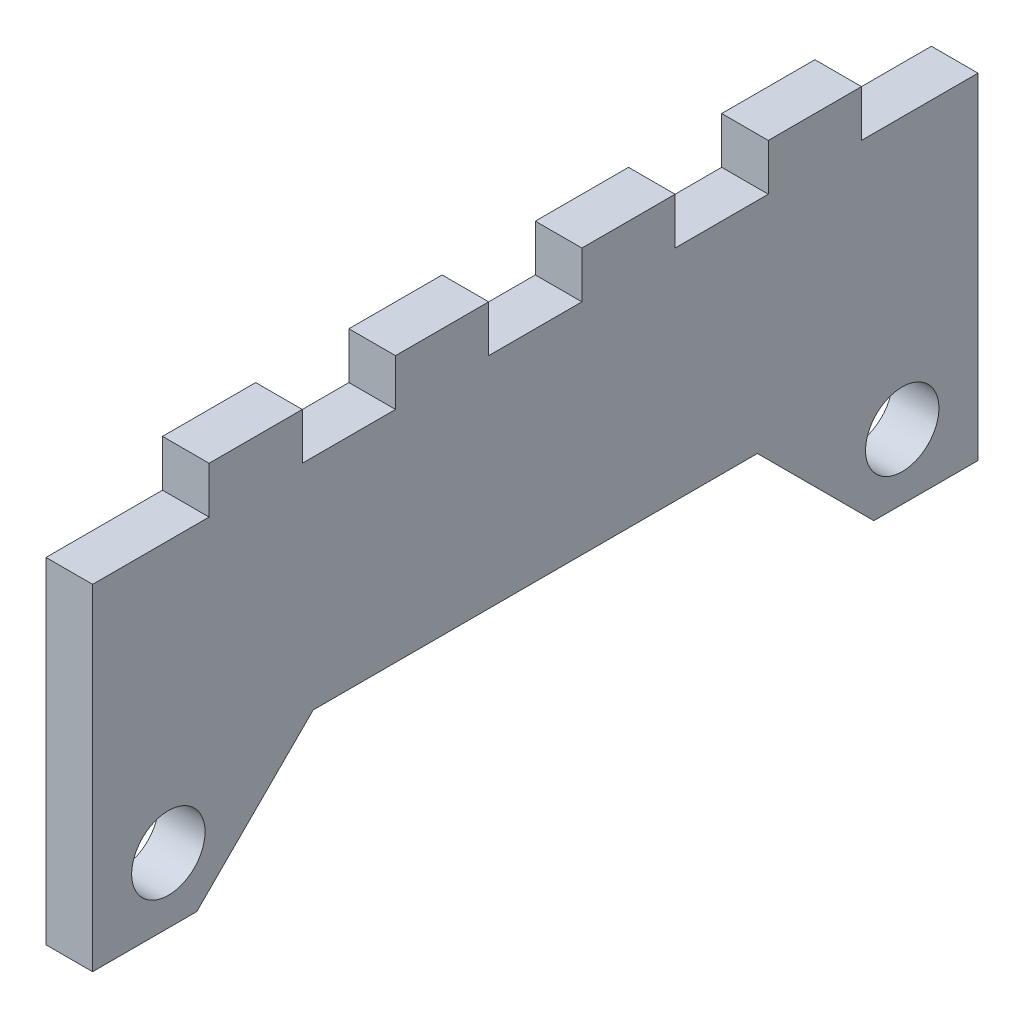
ISO-10303-21;
HEADER;
FILE_DESCRIPTION(('STEP AP214'),'2;1');
FILE_NAME('part.step','',(''),(''),'','','');
FILE_SCHEMA(('AUTOMOTIVE_DESIGN { 1 0 10303 214 1 1 1 1 }'));
ENDSEC;
DATA;
#1=APPLICATION_CONTEXT('core data for automotive mechanical design processes');
#2=APPLICATION_PROTOCOL_DEFINITION('international standard','automotive_design',2000,#1);
#3=PRODUCT_CONTEXT('',#1,'mechanical');
#4=PRODUCT('Part','Part','',(#3));
#5=PRODUCT_RELATED_PRODUCT_CATEGORY('part','',(#4));
#6=PRODUCT_DEFINITION_FORMATION('','',#4);
#7=PRODUCT_DEFINITION_CONTEXT('part definition',#1,'design');
#8=PRODUCT_DEFINITION('design','',#6,#7);
#9=PRODUCT_DEFINITION_SHAPE('','',#8);
#10=(LENGTH_UNIT() NAMED_UNIT(*) SI_UNIT(.MILLI.,.METRE.));
#11=(NAMED_UNIT(*) PLANE_ANGLE_UNIT() SI_UNIT($,.RADIAN.));
#12=(NAMED_UNIT(*) SI_UNIT($,.STERADIAN.) SOLID_ANGLE_UNIT());
#13=UNCERTAINTY_MEASURE_WITH_UNIT(LENGTH_MEASURE(1.E-05),#10,'distance_accuracy_value','');
#14=(GEOMETRIC_REPRESENTATION_CONTEXT(3) GLOBAL_UNCERTAINTY_ASSIGNED_CONTEXT((#13)) GLOBAL_UNIT_ASSIGNED_CONTEXT((#10,
#11,#12)) REPRESENTATION_CONTEXT('',''));
#15=CARTESIAN_POINT('',(0.,0.,0.));
#16=DIRECTION('',(0.,0.,1.));
#17=DIRECTION('',(1.,0.,0.));
#18=AXIS2_PLACEMENT_3D('',#15,#16,#17);
#19=CARTESIAN_POINT('',(3.175,22.86,0.));
#20=DIRECTION('',(-1.,0.,0.));
#21=DIRECTION('',(0.,0.,1.));
#22=AXIS2_PLACEMENT_3D('',#19,#20,#21);
#23=PLANE('',#22);
#24=CARTESIAN_POINT('',(3.175,4.43,-5.1625));
#25=DIRECTION('',(1.,0.,0.));
#26=DIRECTION('',(0.,0.,-1.));
#27=AXIS2_PLACEMENT_3D('',#24,#25,#26);
#28=CIRCLE('',#27,2.5);
#29=CARTESIAN_POINT('',(3.175,4.43,-7.6625));
#30=VERTEX_POINT('',#29);
#31=EDGE_CURVE('E230',#30,#30,#28,.T.);
#32=ORIENTED_EDGE('',*,*,#31,.F.);
#33=EDGE_LOOP('',(#32));
#34=FACE_BOUND('',#33,.T.);
#35=DIRECTION('',(0.,-1.,0.));
#36=VECTOR('',#35,1.);
#37=CARTESIAN_POINT('',(3.175,0.,0.));
#38=LINE('',#37,#36);
#39=CARTESIAN_POINT('',(3.175,22.86,0.));
#40=VERTEX_POINT('',#39);
#41=CARTESIAN_POINT('',(3.175,0.,0.));
#42=VERTEX_POINT('',#41);
#43=EDGE_CURVE('E273',#40,#42,#38,.T.);
#44=ORIENTED_EDGE('',*,*,#43,.T.);
#45=DIRECTION('',(0.,0.,-1.));
#46=VECTOR('',#45,1.);
#47=CARTESIAN_POINT('',(3.175,0.,0.));
#48=LINE('',#47,#46);
#49=CARTESIAN_POINT('',(3.175,0.,-7.09646103067893));
#50=VERTEX_POINT('',#49);
#51=EDGE_CURVE('E141',#42,#50,#48,.T.);
#52=ORIENTED_EDGE('',*,*,#51,.T.);
#53=DIRECTION('',(0.,0.707106781186549,-0.707106781186546));
#54=VECTOR('',#53,1.);
#55=CARTESIAN_POINT('',(3.175,0.,-7.09646103067893));
#56=LINE('',#55,#54);
#57=CARTESIAN_POINT('',(3.175,7.93000000000001,-15.0264610306789));
#58=VERTEX_POINT('',#57);
#59=EDGE_CURVE('E336',#50,#58,#56,.T.);
#60=ORIENTED_EDGE('',*,*,#59,.T.);
#61=DIRECTION('',(0.,0.,-1.));
#62=VECTOR('',#61,1.);
#63=CARTESIAN_POINT('',(3.175,7.93000000000001,-15.0264610306789));
#64=LINE('',#63,#62);
#65=CARTESIAN_POINT('',(3.175,7.93000000000006,-45.2985389693211));
#66=VERTEX_POINT('',#65);
#67=EDGE_CURVE('E355',#58,#66,#64,.T.);
#68=ORIENTED_EDGE('',*,*,#67,.T.);
#69=DIRECTION('',(0.,-0.707106781186546,-0.707106781186549));
#70=VECTOR('',#69,1.);
#71=CARTESIAN_POINT('',(3.175,0.,-53.2285389693211));
#72=LINE('',#71,#70);
#73=CARTESIAN_POINT('',(3.175,0.,-53.2285389693211));
#74=VERTEX_POINT('',#73);
#75=EDGE_CURVE('E352',#66,#74,#72,.T.);
#76=ORIENTED_EDGE('',*,*,#75,.T.);
#77=DIRECTION('',(0.,0.,-1.));
#78=VECTOR('',#77,1.);
#79=CARTESIAN_POINT('',(3.175,0.,-53.2285389693211));
#80=LINE('',#79,#78);
#81=CARTESIAN_POINT('',(3.175,0.,-60.325));
#82=VERTEX_POINT('',#81);
#83=EDGE_CURVE('E354',#74,#82,#80,.T.);
#84=ORIENTED_EDGE('',*,*,#83,.T.);
#85=DIRECTION('',(0.,1.,0.));
#86=VECTOR('',#85,1.);
#87=CARTESIAN_POINT('',(3.175,0.,-60.325));
#88=LINE('',#87,#86);
#89=CARTESIAN_POINT('',(3.175,22.86,-60.325));
#90=VERTEX_POINT('',#89);
#91=EDGE_CURVE('E357',#82,#90,#88,.T.);
#92=ORIENTED_EDGE('',*,*,#91,.T.);
#93=DIRECTION('',(0.,0.,1.));
#94=VECTOR('',#93,1.);
#95=CARTESIAN_POINT('',(3.175,22.86,-52.3875));
#96=LINE('',#95,#94);
#97=CARTESIAN_POINT('',(3.175,22.86,-52.3875));
#98=VERTEX_POINT('',#97);
#99=EDGE_CURVE('E363',#90,#98,#96,.T.);
#100=ORIENTED_EDGE('',*,*,#99,.T.);
#101=DIRECTION('',(0.,1.,0.));
#102=VECTOR('',#101,1.);
#103=CARTESIAN_POINT('',(3.175,22.86,-52.3875));
#104=LINE('',#103,#102);
#105=CARTESIAN_POINT('',(3.175,26.035,-52.3875));
#106=VERTEX_POINT('',#105);
#107=EDGE_CURVE('E365',#98,#106,#104,.T.);
#108=ORIENTED_EDGE('',*,*,#107,.T.);
#109=DIRECTION('',(0.,0.,1.));
#110=VECTOR('',#109,1.);
#111=CARTESIAN_POINT('',(3.175,26.035,-52.3875));
#112=LINE('',#111,#110);
#113=CARTESIAN_POINT('',(3.175,26.035,-46.0375));
#114=VERTEX_POINT('',#113);
#115=EDGE_CURVE('E367',#106,#114,#112,.T.);
#116=ORIENTED_EDGE('',*,*,#115,.T.);
#117=DIRECTION('',(0.,-1.,0.));
#118=VECTOR('',#117,1.);
#119=CARTESIAN_POINT('',(3.175,26.035,-46.0375));
#120=LINE('',#119,#118);
#121=CARTESIAN_POINT('',(3.175,22.86,-46.0375));
#122=VERTEX_POINT('',#121);
#123=EDGE_CURVE('E369',#114,#122,#120,.T.);
#124=ORIENTED_EDGE('',*,*,#123,.T.);
#125=DIRECTION('',(0.,0.,1.));
#126=VECTOR('',#125,1.);
#127=CARTESIAN_POINT('',(3.175,22.86,-39.6875));
#128=LINE('',#127,#126);
#129=CARTESIAN_POINT('',(3.175,22.86,-39.6875));
#130=VERTEX_POINT('',#129);
#131=EDGE_CURVE('E371',#122,#130,#128,.T.);
#132=ORIENTED_EDGE('',*,*,#131,.T.);
#133=DIRECTION('',(0.,1.,0.));
#134=VECTOR('',#133,1.);
#135=CARTESIAN_POINT('',(3.175,22.86,-39.6875));
#136=LINE('',#135,#134);
#137=CARTESIAN_POINT('',(3.175,26.035,-39.6875));
#138=VERTEX_POINT('',#137);
#139=EDGE_CURVE('E373',#130,#138,#136,.T.);
#140=ORIENTED_EDGE('',*,*,#139,.T.);
#141=DIRECTION('',(0.,0.,1.));
#142=VECTOR('',#141,1.);
#143=CARTESIAN_POINT('',(3.175,26.035,-39.6875));
#144=LINE('',#143,#142);
#145=CARTESIAN_POINT('',(3.175,26.035,-33.3375));
#146=VERTEX_POINT('',#145);
#147=EDGE_CURVE('E375',#138,#146,#144,.T.);
#148=ORIENTED_EDGE('',*,*,#147,.T.);
#149=DIRECTION('',(0.,-1.,0.));
#150=VECTOR('',#149,1.);
#151=CARTESIAN_POINT('',(3.175,26.035,-33.3375));
#152=LINE('',#151,#150);
#153=CARTESIAN_POINT('',(3.175,22.86,-33.3375));
#154=VERTEX_POINT('',#153);
#155=EDGE_CURVE('E377',#146,#154,#152,.T.);
#156=ORIENTED_EDGE('',*,*,#155,.T.);
#157=DIRECTION('',(0.,0.,1.));
#158=VECTOR('',#157,1.);
#159=CARTESIAN_POINT('',(3.175,22.86,-26.9875));
#160=LINE('',#159,#158);
#161=CARTESIAN_POINT('',(3.175,22.86,-26.9875));
#162=VERTEX_POINT('',#161);
#163=EDGE_CURVE('E379',#154,#162,#160,.T.);
#164=ORIENTED_EDGE('',*,*,#163,.T.);
#165=DIRECTION('',(0.,1.,0.));
#166=VECTOR('',#165,1.);
#167=CARTESIAN_POINT('',(3.175,22.86,-26.9875));
#168=LINE('',#167,#166);
#169=CARTESIAN_POINT('',(3.175,26.035,-26.9875));
#170=VERTEX_POINT('',#169);
#171=EDGE_CURVE('E381',#162,#170,#168,.T.);
#172=ORIENTED_EDGE('',*,*,#171,.T.);
#173=DIRECTION('',(0.,0.,1.));
#174=VECTOR('',#173,1.);
#175=CARTESIAN_POINT('',(3.175,26.035,-26.9875));
#176=LINE('',#175,#174);
#177=CARTESIAN_POINT('',(3.175,26.035,-20.6375));
#178=VERTEX_POINT('',#177);
#179=EDGE_CURVE('E383',#170,#178,#176,.T.);
#180=ORIENTED_EDGE('',*,*,#179,.T.);
#181=DIRECTION('',(0.,-1.,0.));
#182=VECTOR('',#181,1.);
#183=CARTESIAN_POINT('',(3.175,26.035,-20.6375));
#184=LINE('',#183,#182);
#185=CARTESIAN_POINT('',(3.175,22.86,-20.6375));
#186=VERTEX_POINT('',#185);
#187=EDGE_CURVE('E385',#178,#186,#184,.T.);
#188=ORIENTED_EDGE('',*,*,#187,.T.);
#189=DIRECTION('',(0.,0.,1.));
#190=VECTOR('',#189,1.);
#191=CARTESIAN_POINT('',(3.175,22.86,-14.2875));
#192=LINE('',#191,#190);
#193=CARTESIAN_POINT('',(3.175,22.86,-14.2875));
#194=VERTEX_POINT('',#193);
#195=EDGE_CURVE('E387',#186,#194,#192,.T.);
#196=ORIENTED_EDGE('',*,*,#195,.T.);
#197=DIRECTION('',(0.,1.,0.));
#198=VECTOR('',#197,1.);
#199=CARTESIAN_POINT('',(3.175,22.86,-14.2875));
#200=LINE('',#199,#198);
#201=CARTESIAN_POINT('',(3.175,26.0349999999999,-14.2875));
#202=VERTEX_POINT('',#201);
#203=EDGE_CURVE('E208',#194,#202,#200,.T.);
#204=ORIENTED_EDGE('',*,*,#203,.T.);
#205=DIRECTION('',(0.,0.,1.));
#206=VECTOR('',#205,1.);
#207=CARTESIAN_POINT('',(3.175,26.0349999999999,-14.2875));
#208=LINE('',#207,#206);
#209=CARTESIAN_POINT('',(3.175,26.035,-7.9375));
#210=VERTEX_POINT('',#209);
#211=EDGE_CURVE('E202',#202,#210,#208,.T.);
#212=ORIENTED_EDGE('',*,*,#211,.T.);
#213=DIRECTION('',(0.,-1.,0.));
#214=VECTOR('',#213,1.);
#215=CARTESIAN_POINT('',(3.175,26.035,-7.9375));
#216=LINE('',#215,#214);
#217=CARTESIAN_POINT('',(3.175,22.86,-7.9375));
#218=VERTEX_POINT('',#217);
#219=EDGE_CURVE('E206',#210,#218,#216,.T.);
#220=ORIENTED_EDGE('',*,*,#219,.T.);
#221=DIRECTION('',(0.,0.,1.));
#222=VECTOR('',#221,1.);
#223=CARTESIAN_POINT('',(3.175,22.86,0.));
#224=LINE('',#223,#222);
#225=EDGE_CURVE('E50',#218,#40,#224,.T.);
#226=ORIENTED_EDGE('',*,*,#225,.T.);
#227=EDGE_LOOP('',(#44,#52,#60,#68,#76,#84,#92,#100,#108,#116,#124,#132,#140,#148,#156,#164,
#172,#180,#188,#196,#204,#212,#220,#226));
#228=FACE_BOUND('',#227,.T.);
#229=CARTESIAN_POINT('',(3.175,4.43000000000001,-55.1625));
#230=DIRECTION('',(1.,0.,0.));
#231=DIRECTION('',(0.,0.,1.));
#232=AXIS2_PLACEMENT_3D('',#229,#230,#231);
#233=CIRCLE('',#232,2.5);
#234=CARTESIAN_POINT('',(3.175,4.43000000000001,-52.6625));
#235=VERTEX_POINT('',#234);
#236=EDGE_CURVE('E430',#235,#235,#233,.T.);
#237=ORIENTED_EDGE('',*,*,#236,.F.);
#238=EDGE_LOOP('',(#237));
#239=FACE_BOUND('',#238,.T.);
#240=ADVANCED_FACE('F33',(#34,#228,#239),#23,.F.);
#241=CARTESIAN_POINT('',(0.,22.86,0.));
#242=DIRECTION('',(-1.,0.,0.));
#243=DIRECTION('',(0.,0.,1.));
#244=AXIS2_PLACEMENT_3D('',#241,#242,#243);
#245=PLANE('',#244);
#246=CARTESIAN_POINT('',(0.,4.43,-5.1625));
#247=DIRECTION('',(1.,0.,0.));
#248=DIRECTION('',(0.,0.,-1.));
#249=AXIS2_PLACEMENT_3D('',#246,#247,#248);
#250=CIRCLE('',#249,2.5);
#251=CARTESIAN_POINT('',(0.,4.43,-7.6625));
#252=VERTEX_POINT('',#251);
#253=EDGE_CURVE('E435',#252,#252,#250,.T.);
#254=ORIENTED_EDGE('',*,*,#253,.T.);
#255=EDGE_LOOP('',(#254));
#256=FACE_BOUND('',#255,.T.);
#257=DIRECTION('',(0.,-1.,0.));
#258=VECTOR('',#257,1.);
#259=CARTESIAN_POINT('',(0.,0.,0.));
#260=LINE('',#259,#258);
#261=CARTESIAN_POINT('',(0.,22.86,0.));
#262=VERTEX_POINT('',#261);
#263=CARTESIAN_POINT('',(0.,0.,0.));
#264=VERTEX_POINT('',#263);
#265=EDGE_CURVE('E226',#262,#264,#260,.T.);
#266=ORIENTED_EDGE('',*,*,#265,.F.);
#267=DIRECTION('',(0.,0.,1.));
#268=VECTOR('',#267,1.);
#269=CARTESIAN_POINT('',(0.,22.86,0.));
#270=LINE('',#269,#268);
#271=CARTESIAN_POINT('',(0.,22.86,-7.9375));
#272=VERTEX_POINT('',#271);
#273=EDGE_CURVE('E133',#272,#262,#270,.T.);
#274=ORIENTED_EDGE('',*,*,#273,.F.);
#275=DIRECTION('',(0.,-1.,0.));
#276=VECTOR('',#275,1.);
#277=CARTESIAN_POINT('',(0.,26.035,-7.9375));
#278=LINE('',#277,#276);
#279=CARTESIAN_POINT('',(0.,26.035,-7.9375));
#280=VERTEX_POINT('',#279);
#281=EDGE_CURVE('E127',#280,#272,#278,.T.);
#282=ORIENTED_EDGE('',*,*,#281,.F.);
#283=DIRECTION('',(0.,0.,1.));
#284=VECTOR('',#283,1.);
#285=CARTESIAN_POINT('',(0.,26.0349999999999,-14.2875));
#286=LINE('',#285,#284);
#287=CARTESIAN_POINT('',(0.,26.0349999999999,-14.2875));
#288=VERTEX_POINT('',#287);
#289=EDGE_CURVE('E216',#288,#280,#286,.T.);
#290=ORIENTED_EDGE('',*,*,#289,.F.);
#291=DIRECTION('',(0.,1.,0.));
#292=VECTOR('',#291,1.);
#293=CARTESIAN_POINT('',(0.,22.86,-14.2875));
#294=LINE('',#293,#292);
#295=CARTESIAN_POINT('',(0.,22.86,-14.2875));
#296=VERTEX_POINT('',#295);
#297=EDGE_CURVE('E268',#296,#288,#294,.T.);
#298=ORIENTED_EDGE('',*,*,#297,.F.);
#299=DIRECTION('',(0.,0.,1.));
#300=VECTOR('',#299,1.);
#301=CARTESIAN_POINT('',(0.,22.86,-14.2875));
#302=LINE('',#301,#300);
#303=CARTESIAN_POINT('',(0.,22.86,-20.6375));
#304=VERTEX_POINT('',#303);
#305=EDGE_CURVE('E266',#304,#296,#302,.T.);
#306=ORIENTED_EDGE('',*,*,#305,.F.);
#307=DIRECTION('',(0.,-1.,0.));
#308=VECTOR('',#307,1.);
#309=CARTESIAN_POINT('',(0.,26.035,-20.6375));
#310=LINE('',#309,#308);
#311=CARTESIAN_POINT('',(0.,26.035,-20.6375));
#312=VERTEX_POINT('',#311);
#313=EDGE_CURVE('E264',#312,#304,#310,.T.);
#314=ORIENTED_EDGE('',*,*,#313,.F.);
#315=DIRECTION('',(0.,0.,1.));
#316=VECTOR('',#315,1.);
#317=CARTESIAN_POINT('',(0.,26.035,-26.9875));
#318=LINE('',#317,#316);
#319=CARTESIAN_POINT('',(0.,26.035,-26.9875));
#320=VERTEX_POINT('',#319);
#321=EDGE_CURVE('E262',#320,#312,#318,.T.);
#322=ORIENTED_EDGE('',*,*,#321,.F.);
#323=DIRECTION('',(0.,1.,0.));
#324=VECTOR('',#323,1.);
#325=CARTESIAN_POINT('',(0.,22.86,-26.9875));
#326=LINE('',#325,#324);
#327=CARTESIAN_POINT('',(0.,22.86,-26.9875));
#328=VERTEX_POINT('',#327);
#329=EDGE_CURVE('E260',#328,#320,#326,.T.);
#330=ORIENTED_EDGE('',*,*,#329,.F.);
#331=DIRECTION('',(0.,0.,1.));
#332=VECTOR('',#331,1.);
#333=CARTESIAN_POINT('',(0.,22.86,-26.9875));
#334=LINE('',#333,#332);
#335=CARTESIAN_POINT('',(0.,22.86,-33.3375));
#336=VERTEX_POINT('',#335);
#337=EDGE_CURVE('E258',#336,#328,#334,.T.);
#338=ORIENTED_EDGE('',*,*,#337,.F.);
#339=DIRECTION('',(0.,-1.,0.));
#340=VECTOR('',#339,1.);
#341=CARTESIAN_POINT('',(0.,26.035,-33.3375));
#342=LINE('',#341,#340);
#343=CARTESIAN_POINT('',(0.,26.035,-33.3375));
#344=VERTEX_POINT('',#343);
#345=EDGE_CURVE('E256',#344,#336,#342,.T.);
#346=ORIENTED_EDGE('',*,*,#345,.F.);
#347=DIRECTION('',(0.,0.,1.));
#348=VECTOR('',#347,1.);
#349=CARTESIAN_POINT('',(0.,26.035,-39.6875));
#350=LINE('',#349,#348);
#351=CARTESIAN_POINT('',(0.,26.035,-39.6875));
#352=VERTEX_POINT('',#351);
#353=EDGE_CURVE('E254',#352,#344,#350,.T.);
#354=ORIENTED_EDGE('',*,*,#353,.F.);
#355=DIRECTION('',(0.,1.,0.));
#356=VECTOR('',#355,1.);
#357=CARTESIAN_POINT('',(0.,22.86,-39.6875));
#358=LINE('',#357,#356);
#359=CARTESIAN_POINT('',(0.,22.86,-39.6875));
#360=VERTEX_POINT('',#359);
#361=EDGE_CURVE('E252',#360,#352,#358,.T.);
#362=ORIENTED_EDGE('',*,*,#361,.F.);
#363=DIRECTION('',(0.,0.,1.));
#364=VECTOR('',#363,1.);
#365=CARTESIAN_POINT('',(0.,22.86,-39.6875));
#366=LINE('',#365,#364);
#367=CARTESIAN_POINT('',(0.,22.86,-46.0375));
#368=VERTEX_POINT('',#367);
#369=EDGE_CURVE('E250',#368,#360,#366,.T.);
#370=ORIENTED_EDGE('',*,*,#369,.F.);
#371=DIRECTION('',(0.,-1.,0.));
#372=VECTOR('',#371,1.);
#373=CARTESIAN_POINT('',(0.,26.035,-46.0375));
#374=LINE('',#373,#372);
#375=CARTESIAN_POINT('',(0.,26.035,-46.0375));
#376=VERTEX_POINT('',#375);
#377=EDGE_CURVE('E248',#376,#368,#374,.T.);
#378=ORIENTED_EDGE('',*,*,#377,.F.);
#379=DIRECTION('',(0.,0.,1.));
#380=VECTOR('',#379,1.);
#381=CARTESIAN_POINT('',(0.,26.035,-52.3875));
#382=LINE('',#381,#380);
#383=CARTESIAN_POINT('',(0.,26.035,-52.3875));
#384=VERTEX_POINT('',#383);
#385=EDGE_CURVE('E246',#384,#376,#382,.T.);
#386=ORIENTED_EDGE('',*,*,#385,.F.);
#387=DIRECTION('',(0.,1.,0.));
#388=VECTOR('',#387,1.);
#389=CARTESIAN_POINT('',(0.,22.86,-52.3875));
#390=LINE('',#389,#388);
#391=CARTESIAN_POINT('',(0.,22.86,-52.3875));
#392=VERTEX_POINT('',#391);
#393=EDGE_CURVE('E244',#392,#384,#390,.T.);
#394=ORIENTED_EDGE('',*,*,#393,.F.);
#395=DIRECTION('',(0.,0.,1.));
#396=VECTOR('',#395,1.);
#397=CARTESIAN_POINT('',(0.,22.86,-52.3875));
#398=LINE('',#397,#396);
#399=CARTESIAN_POINT('',(0.,22.86,-60.325));
#400=VERTEX_POINT('',#399);
#401=EDGE_CURVE('E242',#400,#392,#398,.T.);
#402=ORIENTED_EDGE('',*,*,#401,.F.);
#403=DIRECTION('',(0.,1.,0.));
#404=VECTOR('',#403,1.);
#405=CARTESIAN_POINT('',(0.,0.,-60.325));
#406=LINE('',#405,#404);
#407=CARTESIAN_POINT('',(0.,0.,-60.325));
#408=VERTEX_POINT('',#407);
#409=EDGE_CURVE('E240',#408,#400,#406,.T.);
#410=ORIENTED_EDGE('',*,*,#409,.F.);
#411=DIRECTION('',(0.,0.,-1.));
#412=VECTOR('',#411,1.);
#413=CARTESIAN_POINT('',(0.,0.,-53.2285389693211));
#414=LINE('',#413,#412);
#415=CARTESIAN_POINT('',(0.,0.,-53.2285389693211));
#416=VERTEX_POINT('',#415);
#417=EDGE_CURVE('E238',#416,#408,#414,.T.);
#418=ORIENTED_EDGE('',*,*,#417,.F.);
#419=DIRECTION('',(0.,-0.707106781186546,-0.707106781186549));
#420=VECTOR('',#419,1.);
#421=CARTESIAN_POINT('',(0.,0.,-53.2285389693211));
#422=LINE('',#421,#420);
#423=CARTESIAN_POINT('',(0.,7.93000000000006,-45.2985389693211));
#424=VERTEX_POINT('',#423);
#425=EDGE_CURVE('E236',#424,#416,#422,.T.);
#426=ORIENTED_EDGE('',*,*,#425,.F.);
#427=DIRECTION('',(0.,0.,-1.));
#428=VECTOR('',#427,1.);
#429=CARTESIAN_POINT('',(0.,7.93000000000001,-15.0264610306789));
#430=LINE('',#429,#428);
#431=CARTESIAN_POINT('',(0.,7.93000000000001,-15.0264610306789));
#432=VERTEX_POINT('',#431);
#433=EDGE_CURVE('E234',#432,#424,#430,.T.);
#434=ORIENTED_EDGE('',*,*,#433,.F.);
#435=DIRECTION('',(0.,0.707106781186549,-0.707106781186546));
#436=VECTOR('',#435,1.);
#437=CARTESIAN_POINT('',(0.,0.,-7.09646103067893));
#438=LINE('',#437,#436);
#439=CARTESIAN_POINT('',(0.,0.,-7.09646103067893));
#440=VERTEX_POINT('',#439);
#441=EDGE_CURVE('E232',#440,#432,#438,.T.);
#442=ORIENTED_EDGE('',*,*,#441,.F.);
#443=DIRECTION('',(0.,0.,-1.));
#444=VECTOR('',#443,1.);
#445=CARTESIAN_POINT('',(0.,0.,0.));
#446=LINE('',#445,#444);
#447=EDGE_CURVE('E229',#264,#440,#446,.T.);
#448=ORIENTED_EDGE('',*,*,#447,.F.);
#449=EDGE_LOOP('',(#266,#274,#282,#290,#298,#306,#314,#322,#330,#338,#346,#354,#362,#370,#378,
#386,#394,#402,#410,#418,#426,#434,#442,#448));
#450=FACE_BOUND('',#449,.T.);
#451=CARTESIAN_POINT('',(0.,4.43000000000001,-55.1625));
#452=DIRECTION('',(1.,0.,0.));
#453=DIRECTION('',(0.,0.,1.));
#454=AXIS2_PLACEMENT_3D('',#451,#452,#453);
#455=CIRCLE('',#454,2.5);
#456=CARTESIAN_POINT('',(0.,4.43000000000001,-52.6625));
#457=VERTEX_POINT('',#456);
#458=EDGE_CURVE('E433',#457,#457,#455,.T.);
#459=ORIENTED_EDGE('',*,*,#458,.T.);
#460=EDGE_LOOP('',(#459));
#461=FACE_BOUND('',#460,.T.);
#462=ADVANCED_FACE('F340',(#256,#450,#461),#245,.T.);
#463=CARTESIAN_POINT('',(3.175,0.,0.));
#464=DIRECTION('',(0.,0.,-1.));
#465=DIRECTION('',(-1.,0.,0.));
#466=AXIS2_PLACEMENT_3D('',#463,#464,#465);
#467=PLANE('',#466);
#468=ORIENTED_EDGE('',*,*,#265,.T.);
#469=DIRECTION('',(-1.,0.,0.));
#470=VECTOR('',#469,1.);
#471=CARTESIAN_POINT('',(3.175,0.,0.));
#472=LINE('',#471,#470);
#473=EDGE_CURVE('E11',#42,#264,#472,.T.);
#474=ORIENTED_EDGE('',*,*,#473,.F.);
#475=ORIENTED_EDGE('',*,*,#43,.F.);
#476=DIRECTION('',(-1.,0.,0.));
#477=VECTOR('',#476,1.);
#478=CARTESIAN_POINT('',(3.175,22.86,0.));
#479=LINE('',#478,#477);
#480=EDGE_CURVE('E222',#40,#262,#479,.T.);
#481=ORIENTED_EDGE('',*,*,#480,.T.);
#482=EDGE_LOOP('',(#468,#474,#475,#481));
#483=FACE_BOUND('',#482,.T.);
#484=ADVANCED_FACE('F35',(#483),#467,.F.);
#485=CARTESIAN_POINT('',(3.175,0.,0.));
#486=DIRECTION('',(0.,1.,0.));
#487=DIRECTION('',(0.,0.,1.));
#488=AXIS2_PLACEMENT_3D('',#485,#486,#487);
#489=PLANE('',#488);
#490=ORIENTED_EDGE('',*,*,#447,.T.);
#491=DIRECTION('',(-1.,0.,0.));
#492=VECTOR('',#491,1.);
#493=CARTESIAN_POINT('',(3.175,0.,-7.09646103067893));
#494=LINE('',#493,#492);
#495=EDGE_CURVE('E42',#50,#440,#494,.T.);
#496=ORIENTED_EDGE('',*,*,#495,.F.);
#497=ORIENTED_EDGE('',*,*,#51,.F.);
#498=ORIENTED_EDGE('',*,*,#473,.T.);
#499=EDGE_LOOP('',(#490,#496,#497,#498));
#500=FACE_BOUND('',#499,.T.);
#501=ADVANCED_FACE('F648',(#500),#489,.F.);
#502=CARTESIAN_POINT('',(3.175,0.,-7.09646103067893));
#503=DIRECTION('',(0.,0.707106781186546,0.707106781186549));
#504=DIRECTION('',(0.,-0.707106781186549,0.707106781186546));
#505=AXIS2_PLACEMENT_3D('',#502,#503,#504);
#506=PLANE('',#505);
#507=ORIENTED_EDGE('',*,*,#441,.T.);
#508=DIRECTION('',(-1.,0.,0.));
#509=VECTOR('',#508,1.);
#510=CARTESIAN_POINT('',(3.175,7.93000000000001,-15.0264610306789));
#511=LINE('',#510,#509);
#512=EDGE_CURVE('E328',#58,#432,#511,.T.);
#513=ORIENTED_EDGE('',*,*,#512,.F.);
#514=ORIENTED_EDGE('',*,*,#59,.F.);
#515=ORIENTED_EDGE('',*,*,#495,.T.);
#516=EDGE_LOOP('',(#507,#513,#514,#515));
#517=FACE_BOUND('',#516,.T.);
#518=ADVANCED_FACE('F334',(#517),#506,.F.);
#519=CARTESIAN_POINT('',(3.175,7.93000000000001,-15.0264610306789));
#520=DIRECTION('',(0.,1.,0.));
#521=DIRECTION('',(0.,0.,1.));
#522=AXIS2_PLACEMENT_3D('',#519,#520,#521);
#523=PLANE('',#522);
#524=ORIENTED_EDGE('',*,*,#433,.T.);
#525=DIRECTION('',(-1.,0.,0.));
#526=VECTOR('',#525,1.);
#527=CARTESIAN_POINT('',(3.175,7.93000000000006,-45.2985389693211));
#528=LINE('',#527,#526);
#529=EDGE_CURVE('E325',#66,#424,#528,.T.);
#530=ORIENTED_EDGE('',*,*,#529,.F.);
#531=ORIENTED_EDGE('',*,*,#67,.F.);
#532=ORIENTED_EDGE('',*,*,#512,.T.);
#533=EDGE_LOOP('',(#524,#530,#531,#532));
#534=FACE_BOUND('',#533,.T.);
#535=ADVANCED_FACE('F346',(#534),#523,.F.);
#536=CARTESIAN_POINT('',(3.175,0.,-53.2285389693211));
#537=DIRECTION('',(0.,0.707106781186549,-0.707106781186546));
#538=DIRECTION('',(0.,0.707106781186546,0.707106781186549));
#539=AXIS2_PLACEMENT_3D('',#536,#537,#538);
#540=PLANE('',#539);
#541=ORIENTED_EDGE('',*,*,#425,.T.);
#542=DIRECTION('',(-1.,0.,0.));
#543=VECTOR('',#542,1.);
#544=CARTESIAN_POINT('',(3.175,0.,-53.2285389693211));
#545=LINE('',#544,#543);
#546=EDGE_CURVE('E322',#74,#416,#545,.T.);
#547=ORIENTED_EDGE('',*,*,#546,.F.);
#548=ORIENTED_EDGE('',*,*,#75,.F.);
#549=ORIENTED_EDGE('',*,*,#529,.T.);
#550=EDGE_LOOP('',(#541,#547,#548,#549));
#551=FACE_BOUND('',#550,.T.);
#552=ADVANCED_FACE('F350',(#551),#540,.F.);
#553=CARTESIAN_POINT('',(3.175,0.,-53.2285389693211));
#554=DIRECTION('',(0.,1.,0.));
#555=DIRECTION('',(0.,0.,1.));
#556=AXIS2_PLACEMENT_3D('',#553,#554,#555);
#557=PLANE('',#556);
#558=ORIENTED_EDGE('',*,*,#417,.T.);
#559=DIRECTION('',(-1.,0.,0.));
#560=VECTOR('',#559,1.);
#561=CARTESIAN_POINT('',(3.175,0.,-60.325));
#562=LINE('',#561,#560);
#563=EDGE_CURVE('E319',#82,#408,#562,.T.);
#564=ORIENTED_EDGE('',*,*,#563,.F.);
#565=ORIENTED_EDGE('',*,*,#83,.F.);
#566=ORIENTED_EDGE('',*,*,#546,.T.);
#567=EDGE_LOOP('',(#558,#564,#565,#566));
#568=FACE_BOUND('',#567,.T.);
#569=ADVANCED_FACE('F613',(#568),#557,.F.);
#570=CARTESIAN_POINT('',(3.175,0.,-60.325));
#571=DIRECTION('',(0.,0.,1.));
#572=DIRECTION('',(1.,0.,0.));
#573=AXIS2_PLACEMENT_3D('',#570,#571,#572);
#574=PLANE('',#573);
#575=ORIENTED_EDGE('',*,*,#409,.T.);
#576=DIRECTION('',(-1.,0.,0.));
#577=VECTOR('',#576,1.);
#578=CARTESIAN_POINT('',(3.175,22.86,-60.325));
#579=LINE('',#578,#577);
#580=EDGE_CURVE('E316',#90,#400,#579,.T.);
#581=ORIENTED_EDGE('',*,*,#580,.F.);
#582=ORIENTED_EDGE('',*,*,#91,.F.);
#583=ORIENTED_EDGE('',*,*,#563,.T.);
#584=EDGE_LOOP('',(#575,#581,#582,#583));
#585=FACE_BOUND('',#584,.T.);
#586=ADVANCED_FACE('F603',(#585),#574,.F.);
#587=CARTESIAN_POINT('',(3.175,22.86,-52.3875));
#588=DIRECTION('',(0.,-1.,0.));
#589=DIRECTION('',(0.,0.,-1.));
#590=AXIS2_PLACEMENT_3D('',#587,#588,#589);
#591=PLANE('',#590);
#592=ORIENTED_EDGE('',*,*,#401,.T.);
#593=DIRECTION('',(-1.,0.,0.));
#594=VECTOR('',#593,1.);
#595=CARTESIAN_POINT('',(3.175,22.86,-52.3875));
#596=LINE('',#595,#594);
#597=EDGE_CURVE('E313',#98,#392,#596,.T.);
#598=ORIENTED_EDGE('',*,*,#597,.F.);
#599=ORIENTED_EDGE('',*,*,#99,.F.);
#600=ORIENTED_EDGE('',*,*,#580,.T.);
#601=EDGE_LOOP('',(#592,#598,#599,#600));
#602=FACE_BOUND('',#601,.T.);
#603=ADVANCED_FACE('F593',(#602),#591,.F.);
#604=CARTESIAN_POINT('',(3.175,22.86,-52.3875));
#605=DIRECTION('',(0.,0.,1.));
#606=DIRECTION('',(1.,0.,0.));
#607=AXIS2_PLACEMENT_3D('',#604,#605,#606);
#608=PLANE('',#607);
#609=ORIENTED_EDGE('',*,*,#393,.T.);
#610=DIRECTION('',(-1.,0.,0.));
#611=VECTOR('',#610,1.);
#612=CARTESIAN_POINT('',(3.175,26.035,-52.3875));
#613=LINE('',#612,#611);
#614=EDGE_CURVE('E310',#106,#384,#613,.T.);
#615=ORIENTED_EDGE('',*,*,#614,.F.);
#616=ORIENTED_EDGE('',*,*,#107,.F.);
#617=ORIENTED_EDGE('',*,*,#597,.T.);
#618=EDGE_LOOP('',(#609,#615,#616,#617));
#619=FACE_BOUND('',#618,.T.);
#620=ADVANCED_FACE('F583',(#619),#608,.F.);
#621=CARTESIAN_POINT('',(3.175,26.035,-52.3875));
#622=DIRECTION('',(0.,-1.,0.));
#623=DIRECTION('',(0.,0.,-1.));
#624=AXIS2_PLACEMENT_3D('',#621,#622,#623);
#625=PLANE('',#624);
#626=ORIENTED_EDGE('',*,*,#385,.T.);
#627=DIRECTION('',(-1.,0.,0.));
#628=VECTOR('',#627,1.);
#629=CARTESIAN_POINT('',(3.175,26.035,-46.0375));
#630=LINE('',#629,#628);
#631=EDGE_CURVE('E307',#114,#376,#630,.T.);
#632=ORIENTED_EDGE('',*,*,#631,.F.);
#633=ORIENTED_EDGE('',*,*,#115,.F.);
#634=ORIENTED_EDGE('',*,*,#614,.T.);
#635=EDGE_LOOP('',(#626,#632,#633,#634));
#636=FACE_BOUND('',#635,.T.);
#637=ADVANCED_FACE('F573',(#636),#625,.F.);
#638=CARTESIAN_POINT('',(3.175,26.035,-46.0375));
#639=DIRECTION('',(0.,0.,-1.));
#640=DIRECTION('',(-1.,0.,0.));
#641=AXIS2_PLACEMENT_3D('',#638,#639,#640);
#642=PLANE('',#641);
#643=ORIENTED_EDGE('',*,*,#377,.T.);
#644=DIRECTION('',(-1.,0.,0.));
#645=VECTOR('',#644,1.);
#646=CARTESIAN_POINT('',(3.175,22.86,-46.0375));
#647=LINE('',#646,#645);
#648=EDGE_CURVE('E304',#122,#368,#647,.T.);
#649=ORIENTED_EDGE('',*,*,#648,.F.);
#650=ORIENTED_EDGE('',*,*,#123,.F.);
#651=ORIENTED_EDGE('',*,*,#631,.T.);
#652=EDGE_LOOP('',(#643,#649,#650,#651));
#653=FACE_BOUND('',#652,.T.);
#654=ADVANCED_FACE('F563',(#653),#642,.F.);
#655=CARTESIAN_POINT('',(3.175,22.86,-39.6875));
#656=DIRECTION('',(0.,-1.,0.));
#657=DIRECTION('',(0.,0.,-1.));
#658=AXIS2_PLACEMENT_3D('',#655,#656,#657);
#659=PLANE('',#658);
#660=ORIENTED_EDGE('',*,*,#369,.T.);
#661=DIRECTION('',(-1.,0.,0.));
#662=VECTOR('',#661,1.);
#663=CARTESIAN_POINT('',(3.175,22.86,-39.6875));
#664=LINE('',#663,#662);
#665=EDGE_CURVE('E301',#130,#360,#664,.T.);
#666=ORIENTED_EDGE('',*,*,#665,.F.);
#667=ORIENTED_EDGE('',*,*,#131,.F.);
#668=ORIENTED_EDGE('',*,*,#648,.T.);
#669=EDGE_LOOP('',(#660,#666,#667,#668));
#670=FACE_BOUND('',#669,.T.);
#671=ADVANCED_FACE('F553',(#670),#659,.F.);
#672=CARTESIAN_POINT('',(3.175,22.86,-39.6875));
#673=DIRECTION('',(0.,0.,1.));
#674=DIRECTION('',(1.,0.,0.));
#675=AXIS2_PLACEMENT_3D('',#672,#673,#674);
#676=PLANE('',#675);
#677=ORIENTED_EDGE('',*,*,#361,.T.);
#678=DIRECTION('',(-1.,0.,0.));
#679=VECTOR('',#678,1.);
#680=CARTESIAN_POINT('',(3.175,26.035,-39.6875));
#681=LINE('',#680,#679);
#682=EDGE_CURVE('E298',#138,#352,#681,.T.);
#683=ORIENTED_EDGE('',*,*,#682,.F.);
#684=ORIENTED_EDGE('',*,*,#139,.F.);
#685=ORIENTED_EDGE('',*,*,#665,.T.);
#686=EDGE_LOOP('',(#677,#683,#684,#685));
#687=FACE_BOUND('',#686,.T.);
#688=ADVANCED_FACE('F543',(#687),#676,.F.);
#689=CARTESIAN_POINT('',(3.175,26.035,-39.6875));
#690=DIRECTION('',(0.,-1.,0.));
#691=DIRECTION('',(0.,0.,-1.));
#692=AXIS2_PLACEMENT_3D('',#689,#690,#691);
#693=PLANE('',#692);
#694=ORIENTED_EDGE('',*,*,#353,.T.);
#695=DIRECTION('',(-1.,0.,0.));
#696=VECTOR('',#695,1.);
#697=CARTESIAN_POINT('',(3.175,26.035,-33.3375));
#698=LINE('',#697,#696);
#699=EDGE_CURVE('E295',#146,#344,#698,.T.);
#700=ORIENTED_EDGE('',*,*,#699,.F.);
#701=ORIENTED_EDGE('',*,*,#147,.F.);
#702=ORIENTED_EDGE('',*,*,#682,.T.);
#703=EDGE_LOOP('',(#694,#700,#701,#702));
#704=FACE_BOUND('',#703,.T.);
#705=ADVANCED_FACE('F533',(#704),#693,.F.);
#706=CARTESIAN_POINT('',(3.175,26.035,-33.3375));
#707=DIRECTION('',(0.,0.,-1.));
#708=DIRECTION('',(-1.,0.,0.));
#709=AXIS2_PLACEMENT_3D('',#706,#707,#708);
#710=PLANE('',#709);
#711=ORIENTED_EDGE('',*,*,#345,.T.);
#712=DIRECTION('',(-1.,0.,0.));
#713=VECTOR('',#712,1.);
#714=CARTESIAN_POINT('',(3.175,22.86,-33.3375));
#715=LINE('',#714,#713);
#716=EDGE_CURVE('E292',#154,#336,#715,.T.);
#717=ORIENTED_EDGE('',*,*,#716,.F.);
#718=ORIENTED_EDGE('',*,*,#155,.F.);
#719=ORIENTED_EDGE('',*,*,#699,.T.);
#720=EDGE_LOOP('',(#711,#717,#718,#719));
#721=FACE_BOUND('',#720,.T.);
#722=ADVANCED_FACE('F523',(#721),#710,.F.);
#723=CARTESIAN_POINT('',(3.175,22.86,-26.9875));
#724=DIRECTION('',(0.,-1.,0.));
#725=DIRECTION('',(0.,0.,-1.));
#726=AXIS2_PLACEMENT_3D('',#723,#724,#725);
#727=PLANE('',#726);
#728=ORIENTED_EDGE('',*,*,#337,.T.);
#729=DIRECTION('',(-1.,0.,0.));
#730=VECTOR('',#729,1.);
#731=CARTESIAN_POINT('',(3.175,22.86,-26.9875));
#732=LINE('',#731,#730);
#733=EDGE_CURVE('E289',#162,#328,#732,.T.);
#734=ORIENTED_EDGE('',*,*,#733,.F.);
#735=ORIENTED_EDGE('',*,*,#163,.F.);
#736=ORIENTED_EDGE('',*,*,#716,.T.);
#737=EDGE_LOOP('',(#728,#734,#735,#736));
#738=FACE_BOUND('',#737,.T.);
#739=ADVANCED_FACE('F513',(#738),#727,.F.);
#740=CARTESIAN_POINT('',(3.175,22.86,-26.9875));
#741=DIRECTION('',(0.,0.,1.));
#742=DIRECTION('',(1.,0.,0.));
#743=AXIS2_PLACEMENT_3D('',#740,#741,#742);
#744=PLANE('',#743);
#745=ORIENTED_EDGE('',*,*,#329,.T.);
#746=DIRECTION('',(-1.,0.,0.));
#747=VECTOR('',#746,1.);
#748=CARTESIAN_POINT('',(3.175,26.035,-26.9875));
#749=LINE('',#748,#747);
#750=EDGE_CURVE('E286',#170,#320,#749,.T.);
#751=ORIENTED_EDGE('',*,*,#750,.F.);
#752=ORIENTED_EDGE('',*,*,#171,.F.);
#753=ORIENTED_EDGE('',*,*,#733,.T.);
#754=EDGE_LOOP('',(#745,#751,#752,#753));
#755=FACE_BOUND('',#754,.T.);
#756=ADVANCED_FACE('F503',(#755),#744,.F.);
#757=CARTESIAN_POINT('',(3.175,26.035,-26.9875));
#758=DIRECTION('',(0.,-1.,0.));
#759=DIRECTION('',(0.,0.,-1.));
#760=AXIS2_PLACEMENT_3D('',#757,#758,#759);
#761=PLANE('',#760);
#762=ORIENTED_EDGE('',*,*,#321,.T.);
#763=DIRECTION('',(-1.,0.,0.));
#764=VECTOR('',#763,1.);
#765=CARTESIAN_POINT('',(3.175,26.035,-20.6375));
#766=LINE('',#765,#764);
#767=EDGE_CURVE('E283',#178,#312,#766,.T.);
#768=ORIENTED_EDGE('',*,*,#767,.F.);
#769=ORIENTED_EDGE('',*,*,#179,.F.);
#770=ORIENTED_EDGE('',*,*,#750,.T.);
#771=EDGE_LOOP('',(#762,#768,#769,#770));
#772=FACE_BOUND('',#771,.T.);
#773=ADVANCED_FACE('F493',(#772),#761,.F.);
#774=CARTESIAN_POINT('',(3.175,26.035,-20.6375));
#775=DIRECTION('',(0.,0.,-1.));
#776=DIRECTION('',(-1.,0.,0.));
#777=AXIS2_PLACEMENT_3D('',#774,#775,#776);
#778=PLANE('',#777);
#779=ORIENTED_EDGE('',*,*,#313,.T.);
#780=DIRECTION('',(-1.,0.,0.));
#781=VECTOR('',#780,1.);
#782=CARTESIAN_POINT('',(3.175,22.86,-20.6375));
#783=LINE('',#782,#781);
#784=EDGE_CURVE('E280',#186,#304,#783,.T.);
#785=ORIENTED_EDGE('',*,*,#784,.F.);
#786=ORIENTED_EDGE('',*,*,#187,.F.);
#787=ORIENTED_EDGE('',*,*,#767,.T.);
#788=EDGE_LOOP('',(#779,#785,#786,#787));
#789=FACE_BOUND('',#788,.T.);
#790=ADVANCED_FACE('F484',(#789),#778,.F.);
#791=CARTESIAN_POINT('',(3.175,22.86,-14.2875));
#792=DIRECTION('',(0.,-1.,0.));
#793=DIRECTION('',(0.,0.,-1.));
#794=AXIS2_PLACEMENT_3D('',#791,#792,#793);
#795=PLANE('',#794);
#796=ORIENTED_EDGE('',*,*,#305,.T.);
#797=DIRECTION('',(-1.,0.,0.));
#798=VECTOR('',#797,1.);
#799=CARTESIAN_POINT('',(3.175,22.86,-14.2875));
#800=LINE('',#799,#798);
#801=EDGE_CURVE('E277',#194,#296,#800,.T.);
#802=ORIENTED_EDGE('',*,*,#801,.F.);
#803=ORIENTED_EDGE('',*,*,#195,.F.);
#804=ORIENTED_EDGE('',*,*,#784,.T.);
#805=EDGE_LOOP('',(#796,#802,#803,#804));
#806=FACE_BOUND('',#805,.T.);
#807=ADVANCED_FACE('F393',(#806),#795,.F.);
#808=CARTESIAN_POINT('',(3.175,22.86,-14.2875));
#809=DIRECTION('',(0.,0.,1.));
#810=DIRECTION('',(1.,0.,0.));
#811=AXIS2_PLACEMENT_3D('',#808,#809,#810);
#812=PLANE('',#811);
#813=ORIENTED_EDGE('',*,*,#297,.T.);
#814=DIRECTION('',(-1.,0.,0.));
#815=VECTOR('',#814,1.);
#816=CARTESIAN_POINT('',(3.175,26.0349999999999,-14.2875));
#817=LINE('',#816,#815);
#818=EDGE_CURVE('E217',#202,#288,#817,.T.);
#819=ORIENTED_EDGE('',*,*,#818,.F.);
#820=ORIENTED_EDGE('',*,*,#203,.F.);
#821=ORIENTED_EDGE('',*,*,#801,.T.);
#822=EDGE_LOOP('',(#813,#819,#820,#821));
#823=FACE_BOUND('',#822,.T.);
#824=ADVANCED_FACE('F397',(#823),#812,.F.);
#825=CARTESIAN_POINT('',(3.175,26.0349999999999,-14.2875));
#826=DIRECTION('',(0.,-1.,0.));
#827=DIRECTION('',(0.,0.,-1.));
#828=AXIS2_PLACEMENT_3D('',#825,#826,#827);
#829=PLANE('',#828);
#830=ORIENTED_EDGE('',*,*,#289,.T.);
#831=DIRECTION('',(-1.,0.,0.));
#832=VECTOR('',#831,1.);
#833=CARTESIAN_POINT('',(3.175,26.035,-7.9375));
#834=LINE('',#833,#832);
#835=EDGE_CURVE('E213',#210,#280,#834,.T.);
#836=ORIENTED_EDGE('',*,*,#835,.F.);
#837=ORIENTED_EDGE('',*,*,#211,.F.);
#838=ORIENTED_EDGE('',*,*,#818,.T.);
#839=EDGE_LOOP('',(#830,#836,#837,#838));
#840=FACE_BOUND('',#839,.T.);
#841=ADVANCED_FACE('F214',(#840),#829,.F.);
#842=CARTESIAN_POINT('',(3.175,26.035,-7.9375));
#843=DIRECTION('',(0.,0.,-1.));
#844=DIRECTION('',(-1.,0.,0.));
#845=AXIS2_PLACEMENT_3D('',#842,#843,#844);
#846=PLANE('',#845);
#847=ORIENTED_EDGE('',*,*,#281,.T.);
#848=DIRECTION('',(-1.,0.,0.));
#849=VECTOR('',#848,1.);
#850=CARTESIAN_POINT('',(3.175,22.86,-7.9375));
#851=LINE('',#850,#849);
#852=EDGE_CURVE('E218',#218,#272,#851,.T.);
#853=ORIENTED_EDGE('',*,*,#852,.F.);
#854=ORIENTED_EDGE('',*,*,#219,.F.);
#855=ORIENTED_EDGE('',*,*,#835,.T.);
#856=EDGE_LOOP('',(#847,#853,#854,#855));
#857=FACE_BOUND('',#856,.T.);
#858=ADVANCED_FACE('F220',(#857),#846,.F.);
#859=CARTESIAN_POINT('',(3.175,22.86,0.));
#860=DIRECTION('',(0.,-1.,0.));
#861=DIRECTION('',(0.,0.,-1.));
#862=AXIS2_PLACEMENT_3D('',#859,#860,#861);
#863=PLANE('',#862);
#864=ORIENTED_EDGE('',*,*,#273,.T.);
#865=ORIENTED_EDGE('',*,*,#480,.F.);
#866=ORIENTED_EDGE('',*,*,#225,.F.);
#867=ORIENTED_EDGE('',*,*,#852,.T.);
#868=EDGE_LOOP('',(#864,#865,#866,#867));
#869=FACE_BOUND('',#868,.T.);
#870=ADVANCED_FACE('F401',(#869),#863,.F.);
#871=CARTESIAN_POINT('',(3.175,4.43,-5.1625));
#872=DIRECTION('',(-1.,0.,0.));
#873=DIRECTION('',(0.,0.,1.));
#874=AXIS2_PLACEMENT_3D('',#871,#872,#873);
#875=CYLINDRICAL_SURFACE('',#874,2.5);
#876=ORIENTED_EDGE('',*,*,#31,.T.);
#877=EDGE_LOOP('',(#876));
#878=FACE_BOUND('',#877,.T.);
#879=ORIENTED_EDGE('',*,*,#253,.F.);
#880=EDGE_LOOP('',(#879));
#881=FACE_BOUND('',#880,.T.);
#882=ADVANCED_FACE('F403',(#878,#881),#875,.F.);
#883=CARTESIAN_POINT('',(3.175,4.43000000000001,-55.1625));
#884=DIRECTION('',(-1.,0.,0.));
#885=DIRECTION('',(0.,0.,1.));
#886=AXIS2_PLACEMENT_3D('',#883,#884,#885);
#887=CYLINDRICAL_SURFACE('',#886,2.5);
#888=ORIENTED_EDGE('',*,*,#236,.T.);
#889=EDGE_LOOP('',(#888));
#890=FACE_BOUND('',#889,.T.);
#891=ORIENTED_EDGE('',*,*,#458,.F.);
#892=EDGE_LOOP('',(#891));
#893=FACE_BOUND('',#892,.T.);
#894=ADVANCED_FACE('F409',(#890,#893),#887,.F.);
#895=CLOSED_SHELL('',(#240,#462,#484,#501,#518,#535,#552,#569,#586,#603,#620,#637,#654,#671,
#688,#705,#722,#739,#756,#773,#790,#807,#824,#841,#858,#870,#882,#894));
#896=MANIFOLD_SOLID_BREP('B2',#895);
#897=ADVANCED_BREP_SHAPE_REPRESENTATION('',(#18,#896),#14);
#898=SHAPE_DEFINITION_REPRESENTATION(#9,#897);
ENDSEC;
END-ISO-10303-21;
